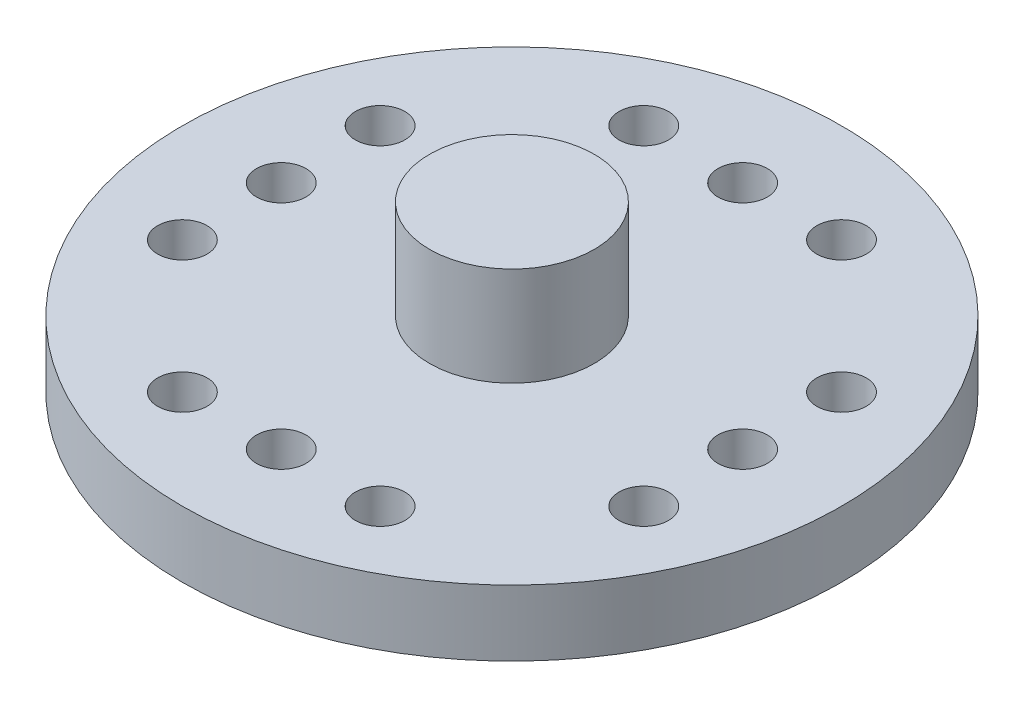
ISO-10303-21;
HEADER;
FILE_DESCRIPTION(('STEP AP214'),'2;1');
FILE_NAME('part.step','',(''),(''),'','','');
FILE_SCHEMA(('AUTOMOTIVE_DESIGN { 1 0 10303 214 1 1 1 1 }'));
ENDSEC;
DATA;
#1=APPLICATION_CONTEXT('core data for automotive mechanical design processes');
#2=APPLICATION_PROTOCOL_DEFINITION('international standard','automotive_design',2000,#1);
#3=PRODUCT_CONTEXT('',#1,'mechanical');
#4=PRODUCT('Part','Part','',(#3));
#5=PRODUCT_RELATED_PRODUCT_CATEGORY('part','',(#4));
#6=PRODUCT_DEFINITION_FORMATION('','',#4);
#7=PRODUCT_DEFINITION_CONTEXT('part definition',#1,'design');
#8=PRODUCT_DEFINITION('design','',#6,#7);
#9=PRODUCT_DEFINITION_SHAPE('','',#8);
#10=(LENGTH_UNIT() NAMED_UNIT(*) SI_UNIT(.MILLI.,.METRE.));
#11=(NAMED_UNIT(*) PLANE_ANGLE_UNIT() SI_UNIT($,.RADIAN.));
#12=(NAMED_UNIT(*) SI_UNIT($,.STERADIAN.) SOLID_ANGLE_UNIT());
#13=UNCERTAINTY_MEASURE_WITH_UNIT(LENGTH_MEASURE(1.E-05),#10,'distance_accuracy_value','');
#14=(GEOMETRIC_REPRESENTATION_CONTEXT(3) GLOBAL_UNCERTAINTY_ASSIGNED_CONTEXT((#13)) GLOBAL_UNIT_ASSIGNED_CONTEXT((#10,
#11,#12)) REPRESENTATION_CONTEXT('',''));
#15=CARTESIAN_POINT('',(0.,0.,0.));
#16=DIRECTION('',(0.,0.,1.));
#17=DIRECTION('',(1.,0.,0.));
#18=AXIS2_PLACEMENT_3D('',#15,#16,#17);
#19=CARTESIAN_POINT('',(0.,2.,0.));
#20=DIRECTION('',(0.,-1.,0.));
#21=DIRECTION('',(0.,0.,-1.));
#22=AXIS2_PLACEMENT_3D('',#19,#20,#21);
#23=CYLINDRICAL_SURFACE('',#22,10.);
#24=CARTESIAN_POINT('',(0.,2.,0.));
#25=DIRECTION('',(0.,1.,0.));
#26=DIRECTION('',(0.,0.,1.));
#27=AXIS2_PLACEMENT_3D('',#24,#25,#26);
#28=CIRCLE('',#27,10.);
#29=CARTESIAN_POINT('',(0.,2.,10.));
#30=VERTEX_POINT('',#29);
#31=EDGE_CURVE('E45',#30,#30,#28,.T.);
#32=ORIENTED_EDGE('',*,*,#31,.F.);
#33=EDGE_LOOP('',(#32));
#34=FACE_BOUND('',#33,.T.);
#35=CARTESIAN_POINT('',(0.,0.,0.));
#36=DIRECTION('',(0.,1.,0.));
#37=DIRECTION('',(0.,0.,1.));
#38=AXIS2_PLACEMENT_3D('',#35,#36,#37);
#39=CIRCLE('',#38,10.);
#40=CARTESIAN_POINT('',(0.,0.,10.));
#41=VERTEX_POINT('',#40);
#42=EDGE_CURVE('E40',#41,#41,#39,.T.);
#43=ORIENTED_EDGE('',*,*,#42,.T.);
#44=EDGE_LOOP('',(#43));
#45=FACE_BOUND('',#44,.T.);
#46=ADVANCED_FACE('F37',(#34,#45),#23,.T.);
#47=CARTESIAN_POINT('',(0.,2.,0.));
#48=DIRECTION('',(0.,1.,0.));
#49=DIRECTION('',(0.,0.,1.));
#50=AXIS2_PLACEMENT_3D('',#47,#48,#49);
#51=PLANE('',#50);
#52=CARTESIAN_POINT('',(-3.,2.,-7.));
#53=DIRECTION('',(0.,1.,0.));
#54=DIRECTION('',(0.,0.,1.));
#55=AXIS2_PLACEMENT_3D('',#52,#53,#54);
#56=CIRCLE('',#55,0.75);
#57=CARTESIAN_POINT('',(-3.,2.,-6.25));
#58=VERTEX_POINT('',#57);
#59=EDGE_CURVE('E61',#58,#58,#56,.T.);
#60=ORIENTED_EDGE('',*,*,#59,.F.);
#61=EDGE_LOOP('',(#60));
#62=FACE_BOUND('',#61,.T.);
#63=CARTESIAN_POINT('',(0.,2.,-7.));
#64=DIRECTION('',(0.,1.,0.));
#65=DIRECTION('',(0.,0.,1.));
#66=AXIS2_PLACEMENT_3D('',#63,#64,#65);
#67=CIRCLE('',#66,0.75);
#68=CARTESIAN_POINT('',(0.,2.,-6.25));
#69=VERTEX_POINT('',#68);
#70=EDGE_CURVE('E118',#69,#69,#67,.T.);
#71=ORIENTED_EDGE('',*,*,#70,.F.);
#72=EDGE_LOOP('',(#71));
#73=FACE_BOUND('',#72,.T.);
#74=CARTESIAN_POINT('',(3.,2.,-7.));
#75=DIRECTION('',(0.,1.,0.));
#76=DIRECTION('',(0.,0.,1.));
#77=AXIS2_PLACEMENT_3D('',#74,#75,#76);
#78=CIRCLE('',#77,0.75);
#79=CARTESIAN_POINT('',(3.,2.,-6.25));
#80=VERTEX_POINT('',#79);
#81=EDGE_CURVE('E110',#80,#80,#78,.T.);
#82=ORIENTED_EDGE('',*,*,#81,.F.);
#83=EDGE_LOOP('',(#82));
#84=FACE_BOUND('',#83,.T.);
#85=CARTESIAN_POINT('',(7.00000000000051,2.,-3.00000000000068));
#86=DIRECTION('',(0.,1.,0.));
#87=DIRECTION('',(0.,0.,1.));
#88=AXIS2_PLACEMENT_3D('',#85,#86,#87);
#89=CIRCLE('',#88,0.750000000000525);
#90=CARTESIAN_POINT('',(7.00000000000051,2.,-2.25000000000015));
#91=VERTEX_POINT('',#90);
#92=EDGE_CURVE('E102',#91,#91,#89,.T.);
#93=ORIENTED_EDGE('',*,*,#92,.F.);
#94=EDGE_LOOP('',(#93));
#95=FACE_BOUND('',#94,.T.);
#96=CARTESIAN_POINT('',(7.00000000000051,2.,-6.77969384008271E-13));
#97=DIRECTION('',(0.,1.,0.));
#98=DIRECTION('',(0.,0.,1.));
#99=AXIS2_PLACEMENT_3D('',#96,#97,#98);
#100=CIRCLE('',#99,0.750000000000522);
#101=CARTESIAN_POINT('',(7.00000000000051,2.,0.749999999999844));
#102=VERTEX_POINT('',#101);
#103=EDGE_CURVE('E94',#102,#102,#100,.T.);
#104=ORIENTED_EDGE('',*,*,#103,.F.);
#105=EDGE_LOOP('',(#104));
#106=FACE_BOUND('',#105,.T.);
#107=CARTESIAN_POINT('',(7.00000000000051,2.,2.99999999999932));
#108=DIRECTION('',(0.,1.,0.));
#109=DIRECTION('',(0.,0.,1.));
#110=AXIS2_PLACEMENT_3D('',#107,#108,#109);
#111=CIRCLE('',#110,0.750000000000518);
#112=CARTESIAN_POINT('',(7.00000000000051,2.,3.74999999999984));
#113=VERTEX_POINT('',#112);
#114=EDGE_CURVE('E86',#113,#113,#111,.T.);
#115=ORIENTED_EDGE('',*,*,#114,.F.);
#116=EDGE_LOOP('',(#115));
#117=FACE_BOUND('',#116,.T.);
#118=CARTESIAN_POINT('',(3.00000000000119,2.,6.99999999999984));
#119=DIRECTION('',(0.,1.,0.));
#120=DIRECTION('',(0.,0.,1.));
#121=AXIS2_PLACEMENT_3D('',#118,#119,#120);
#122=CIRCLE('',#121,0.75000000000124);
#123=CARTESIAN_POINT('',(3.00000000000119,2.,7.75000000000108));
#124=VERTEX_POINT('',#123);
#125=EDGE_CURVE('E78',#124,#124,#122,.T.);
#126=ORIENTED_EDGE('',*,*,#125,.F.);
#127=EDGE_LOOP('',(#126));
#128=FACE_BOUND('',#127,.T.);
#129=CARTESIAN_POINT('',(-2.99999999999881,2.,6.99999999999984));
#130=DIRECTION('',(0.,1.,0.));
#131=DIRECTION('',(0.,0.,1.));
#132=AXIS2_PLACEMENT_3D('',#129,#130,#131);
#133=CIRCLE('',#132,0.750000000001228);
#134=CARTESIAN_POINT('',(-2.99999999999881,2.,7.75000000000106));
#135=VERTEX_POINT('',#134);
#136=EDGE_CURVE('E69',#135,#135,#133,.T.);
#137=ORIENTED_EDGE('',*,*,#136,.F.);
#138=EDGE_LOOP('',(#137));
#139=FACE_BOUND('',#138,.T.);
#140=CARTESIAN_POINT('',(-6.99999999999932,2.,3.00000000000051));
#141=DIRECTION('',(0.,1.,0.));
#142=DIRECTION('',(0.,0.,1.));
#143=AXIS2_PLACEMENT_3D('',#140,#141,#142);
#144=CIRCLE('',#143,0.750000000000769);
#145=CARTESIAN_POINT('',(-6.99999999999932,2.,3.75000000000128));
#146=VERTEX_POINT('',#145);
#147=EDGE_CURVE('E70',#146,#146,#144,.T.);
#148=ORIENTED_EDGE('',*,*,#147,.F.);
#149=EDGE_LOOP('',(#148));
#150=FACE_BOUND('',#149,.T.);
#151=CARTESIAN_POINT('',(-6.99999999999932,2.,5.14027906549877E-13));
#152=DIRECTION('',(0.,1.,0.));
#153=DIRECTION('',(0.,0.,1.));
#154=AXIS2_PLACEMENT_3D('',#151,#152,#153);
#155=CIRCLE('',#154,0.75000000000076);
#156=CARTESIAN_POINT('',(-6.99999999999932,2.,0.750000000001274));
#157=VERTEX_POINT('',#156);
#158=EDGE_CURVE('E141',#157,#157,#155,.T.);
#159=ORIENTED_EDGE('',*,*,#158,.F.);
#160=EDGE_LOOP('',(#159));
#161=FACE_BOUND('',#160,.T.);
#162=CARTESIAN_POINT('',(1.19114003779875E-12,2.,6.99999999999984));
#163=DIRECTION('',(0.,1.,0.));
#164=DIRECTION('',(0.,0.,1.));
#165=AXIS2_PLACEMENT_3D('',#162,#163,#164);
#166=CIRCLE('',#165,0.750000000001234);
#167=CARTESIAN_POINT('',(1.19114003779875E-12,2.,7.75000000000107));
#168=VERTEX_POINT('',#167);
#169=EDGE_CURVE('E133',#168,#168,#166,.T.);
#170=ORIENTED_EDGE('',*,*,#169,.F.);
#171=EDGE_LOOP('',(#170));
#172=FACE_BOUND('',#171,.T.);
#173=CARTESIAN_POINT('',(-6.99999999999932,2.,-2.99999999999949));
#174=DIRECTION('',(0.,1.,0.));
#175=DIRECTION('',(0.,0.,1.));
#176=AXIS2_PLACEMENT_3D('',#173,#174,#175);
#177=CIRCLE('',#176,0.75000000000075);
#178=CARTESIAN_POINT('',(-6.99999999999932,2.,-2.24999999999874));
#179=VERTEX_POINT('',#178);
#180=EDGE_CURVE('E57',#179,#179,#177,.T.);
#181=ORIENTED_EDGE('',*,*,#180,.F.);
#182=EDGE_LOOP('',(#181));
#183=FACE_BOUND('',#182,.T.);
#184=CARTESIAN_POINT('',(0.,2.,0.));
#185=DIRECTION('',(0.,1.,0.));
#186=DIRECTION('',(0.,0.,1.));
#187=AXIS2_PLACEMENT_3D('',#184,#185,#186);
#188=CIRCLE('',#187,2.5);
#189=CARTESIAN_POINT('',(0.,2.,2.5));
#190=VERTEX_POINT('',#189);
#191=EDGE_CURVE('E10',#190,#190,#188,.T.);
#192=ORIENTED_EDGE('',*,*,#191,.F.);
#193=EDGE_LOOP('',(#192));
#194=FACE_BOUND('',#193,.T.);
#195=ORIENTED_EDGE('',*,*,#31,.T.);
#196=EDGE_LOOP('',(#195));
#197=FACE_BOUND('',#196,.T.);
#198=ADVANCED_FACE('F155',(#62,#73,#84,#95,#106,#117,#128,#139,#150,#161,#172,#183,#194,#197),
#51,.T.);
#199=CARTESIAN_POINT('',(0.,0.,0.));
#200=DIRECTION('',(0.,1.,0.));
#201=DIRECTION('',(0.,0.,1.));
#202=AXIS2_PLACEMENT_3D('',#199,#200,#201);
#203=PLANE('',#202);
#204=CARTESIAN_POINT('',(-3.,0.,-7.));
#205=DIRECTION('',(0.,1.,0.));
#206=DIRECTION('',(0.,0.,1.));
#207=AXIS2_PLACEMENT_3D('',#204,#205,#206);
#208=CIRCLE('',#207,0.75);
#209=CARTESIAN_POINT('',(-3.,0.,-6.25));
#210=VERTEX_POINT('',#209);
#211=EDGE_CURVE('E122',#210,#210,#208,.T.);
#212=ORIENTED_EDGE('',*,*,#211,.T.);
#213=EDGE_LOOP('',(#212));
#214=FACE_BOUND('',#213,.T.);
#215=CARTESIAN_POINT('',(0.,0.,-7.));
#216=DIRECTION('',(0.,1.,0.));
#217=DIRECTION('',(0.,0.,1.));
#218=AXIS2_PLACEMENT_3D('',#215,#216,#217);
#219=CIRCLE('',#218,0.75);
#220=CARTESIAN_POINT('',(0.,0.,-6.25));
#221=VERTEX_POINT('',#220);
#222=EDGE_CURVE('E114',#221,#221,#219,.T.);
#223=ORIENTED_EDGE('',*,*,#222,.T.);
#224=EDGE_LOOP('',(#223));
#225=FACE_BOUND('',#224,.T.);
#226=CARTESIAN_POINT('',(3.,0.,-7.));
#227=DIRECTION('',(0.,1.,0.));
#228=DIRECTION('',(0.,0.,1.));
#229=AXIS2_PLACEMENT_3D('',#226,#227,#228);
#230=CIRCLE('',#229,0.75);
#231=CARTESIAN_POINT('',(3.,0.,-6.25));
#232=VERTEX_POINT('',#231);
#233=EDGE_CURVE('E106',#232,#232,#230,.T.);
#234=ORIENTED_EDGE('',*,*,#233,.T.);
#235=EDGE_LOOP('',(#234));
#236=FACE_BOUND('',#235,.T.);
#237=CARTESIAN_POINT('',(7.00000000000051,0.,-3.00000000000068));
#238=DIRECTION('',(0.,1.,0.));
#239=DIRECTION('',(0.,0.,1.));
#240=AXIS2_PLACEMENT_3D('',#237,#238,#239);
#241=CIRCLE('',#240,0.750000000000525);
#242=CARTESIAN_POINT('',(7.00000000000051,0.,-2.25000000000015));
#243=VERTEX_POINT('',#242);
#244=EDGE_CURVE('E98',#243,#243,#241,.T.);
#245=ORIENTED_EDGE('',*,*,#244,.T.);
#246=EDGE_LOOP('',(#245));
#247=FACE_BOUND('',#246,.T.);
#248=CARTESIAN_POINT('',(7.00000000000051,0.,-6.77969384008271E-13));
#249=DIRECTION('',(0.,1.,0.));
#250=DIRECTION('',(0.,0.,1.));
#251=AXIS2_PLACEMENT_3D('',#248,#249,#250);
#252=CIRCLE('',#251,0.750000000000522);
#253=CARTESIAN_POINT('',(7.00000000000051,0.,0.749999999999844));
#254=VERTEX_POINT('',#253);
#255=EDGE_CURVE('E90',#254,#254,#252,.T.);
#256=ORIENTED_EDGE('',*,*,#255,.T.);
#257=EDGE_LOOP('',(#256));
#258=FACE_BOUND('',#257,.T.);
#259=CARTESIAN_POINT('',(7.00000000000051,0.,2.99999999999932));
#260=DIRECTION('',(0.,1.,0.));
#261=DIRECTION('',(0.,0.,1.));
#262=AXIS2_PLACEMENT_3D('',#259,#260,#261);
#263=CIRCLE('',#262,0.750000000000518);
#264=CARTESIAN_POINT('',(7.00000000000051,0.,3.74999999999984));
#265=VERTEX_POINT('',#264);
#266=EDGE_CURVE('E82',#265,#265,#263,.T.);
#267=ORIENTED_EDGE('',*,*,#266,.T.);
#268=EDGE_LOOP('',(#267));
#269=FACE_BOUND('',#268,.T.);
#270=CARTESIAN_POINT('',(3.00000000000119,0.,6.99999999999984));
#271=DIRECTION('',(0.,1.,0.));
#272=DIRECTION('',(0.,0.,1.));
#273=AXIS2_PLACEMENT_3D('',#270,#271,#272);
#274=CIRCLE('',#273,0.75000000000124);
#275=CARTESIAN_POINT('',(3.00000000000119,0.,7.75000000000108));
#276=VERTEX_POINT('',#275);
#277=EDGE_CURVE('E74',#276,#276,#274,.T.);
#278=ORIENTED_EDGE('',*,*,#277,.T.);
#279=EDGE_LOOP('',(#278));
#280=FACE_BOUND('',#279,.T.);
#281=CARTESIAN_POINT('',(-2.99999999999881,0.,6.99999999999984));
#282=DIRECTION('',(0.,1.,0.));
#283=DIRECTION('',(0.,0.,1.));
#284=AXIS2_PLACEMENT_3D('',#281,#282,#283);
#285=CIRCLE('',#284,0.750000000001228);
#286=CARTESIAN_POINT('',(-2.99999999999881,0.,7.75000000000106));
#287=VERTEX_POINT('',#286);
#288=EDGE_CURVE('E65',#287,#287,#285,.T.);
#289=ORIENTED_EDGE('',*,*,#288,.T.);
#290=EDGE_LOOP('',(#289));
#291=FACE_BOUND('',#290,.T.);
#292=CARTESIAN_POINT('',(-6.99999999999932,0.,3.00000000000051));
#293=DIRECTION('',(0.,1.,0.));
#294=DIRECTION('',(0.,0.,1.));
#295=AXIS2_PLACEMENT_3D('',#292,#293,#294);
#296=CIRCLE('',#295,0.750000000000769);
#297=CARTESIAN_POINT('',(-6.99999999999932,0.,3.75000000000128));
#298=VERTEX_POINT('',#297);
#299=EDGE_CURVE('E145',#298,#298,#296,.T.);
#300=ORIENTED_EDGE('',*,*,#299,.T.);
#301=EDGE_LOOP('',(#300));
#302=FACE_BOUND('',#301,.T.);
#303=CARTESIAN_POINT('',(-6.99999999999932,0.,5.14027906549877E-13));
#304=DIRECTION('',(0.,1.,0.));
#305=DIRECTION('',(0.,0.,1.));
#306=AXIS2_PLACEMENT_3D('',#303,#304,#305);
#307=CIRCLE('',#306,0.75000000000076);
#308=CARTESIAN_POINT('',(-6.99999999999932,0.,0.750000000001274));
#309=VERTEX_POINT('',#308);
#310=EDGE_CURVE('E137',#309,#309,#307,.T.);
#311=ORIENTED_EDGE('',*,*,#310,.T.);
#312=EDGE_LOOP('',(#311));
#313=FACE_BOUND('',#312,.T.);
#314=CARTESIAN_POINT('',(1.19114003779875E-12,0.,6.99999999999984));
#315=DIRECTION('',(0.,1.,0.));
#316=DIRECTION('',(0.,0.,1.));
#317=AXIS2_PLACEMENT_3D('',#314,#315,#316);
#318=CIRCLE('',#317,0.750000000001234);
#319=CARTESIAN_POINT('',(1.19114003779875E-12,0.,7.75000000000107));
#320=VERTEX_POINT('',#319);
#321=EDGE_CURVE('E129',#320,#320,#318,.T.);
#322=ORIENTED_EDGE('',*,*,#321,.T.);
#323=EDGE_LOOP('',(#322));
#324=FACE_BOUND('',#323,.T.);
#325=CARTESIAN_POINT('',(-6.99999999999932,0.,-2.99999999999949));
#326=DIRECTION('',(0.,1.,0.));
#327=DIRECTION('',(0.,0.,1.));
#328=AXIS2_PLACEMENT_3D('',#325,#326,#327);
#329=CIRCLE('',#328,0.75000000000075);
#330=CARTESIAN_POINT('',(-6.99999999999932,0.,-2.24999999999874));
#331=VERTEX_POINT('',#330);
#332=EDGE_CURVE('E56',#331,#331,#329,.T.);
#333=ORIENTED_EDGE('',*,*,#332,.T.);
#334=EDGE_LOOP('',(#333));
#335=FACE_BOUND('',#334,.T.);
#336=ORIENTED_EDGE('',*,*,#42,.F.);
#337=EDGE_LOOP('',(#336));
#338=FACE_BOUND('',#337,.T.);
#339=ADVANCED_FACE('F158',(#214,#225,#236,#247,#258,#269,#280,#291,#302,#313,#324,#335,#338),
#203,.F.);
#340=CARTESIAN_POINT('',(0.,5.,0.));
#341=DIRECTION('',(0.,-1.,0.));
#342=DIRECTION('',(0.,0.,-1.));
#343=AXIS2_PLACEMENT_3D('',#340,#341,#342);
#344=CYLINDRICAL_SURFACE('',#343,2.5);
#345=CARTESIAN_POINT('',(0.,5.,0.));
#346=DIRECTION('',(0.,1.,0.));
#347=DIRECTION('',(0.,0.,1.));
#348=AXIS2_PLACEMENT_3D('',#345,#346,#347);
#349=CIRCLE('',#348,2.5);
#350=CARTESIAN_POINT('',(0.,5.,2.5));
#351=VERTEX_POINT('',#350);
#352=EDGE_CURVE('E52',#351,#351,#349,.T.);
#353=ORIENTED_EDGE('',*,*,#352,.F.);
#354=EDGE_LOOP('',(#353));
#355=FACE_BOUND('',#354,.T.);
#356=ORIENTED_EDGE('',*,*,#191,.T.);
#357=EDGE_LOOP('',(#356));
#358=FACE_BOUND('',#357,.T.);
#359=ADVANCED_FACE('F177',(#355,#358),#344,.T.);
#360=CARTESIAN_POINT('',(0.,5.,0.));
#361=DIRECTION('',(0.,1.,0.));
#362=DIRECTION('',(0.,0.,1.));
#363=AXIS2_PLACEMENT_3D('',#360,#361,#362);
#364=PLANE('',#363);
#365=ORIENTED_EDGE('',*,*,#352,.T.);
#366=EDGE_LOOP('',(#365));
#367=FACE_BOUND('',#366,.T.);
#368=ADVANCED_FACE('F182',(#367),#364,.T.);
#369=CARTESIAN_POINT('',(-6.99999999999932,0.,-2.99999999999949));
#370=DIRECTION('',(0.,1.,0.));
#371=DIRECTION('',(0.,0.,1.));
#372=AXIS2_PLACEMENT_3D('',#369,#370,#371);
#373=CYLINDRICAL_SURFACE('',#372,0.75000000000075);
#374=ORIENTED_EDGE('',*,*,#332,.F.);
#375=EDGE_LOOP('',(#374));
#376=FACE_BOUND('',#375,.T.);
#377=ORIENTED_EDGE('',*,*,#180,.T.);
#378=EDGE_LOOP('',(#377));
#379=FACE_BOUND('',#378,.T.);
#380=ADVANCED_FACE('F189',(#376,#379),#373,.F.);
#381=CARTESIAN_POINT('',(1.19114003779875E-12,0.,6.99999999999984));
#382=DIRECTION('',(0.,1.,0.));
#383=DIRECTION('',(0.,0.,1.));
#384=AXIS2_PLACEMENT_3D('',#381,#382,#383);
#385=CYLINDRICAL_SURFACE('',#384,0.750000000001234);
#386=ORIENTED_EDGE('',*,*,#321,.F.);
#387=EDGE_LOOP('',(#386));
#388=FACE_BOUND('',#387,.T.);
#389=ORIENTED_EDGE('',*,*,#169,.T.);
#390=EDGE_LOOP('',(#389));
#391=FACE_BOUND('',#390,.T.);
#392=ADVANCED_FACE('F193',(#388,#391),#385,.F.);
#393=CARTESIAN_POINT('',(-6.99999999999932,0.,5.14027906549877E-13));
#394=DIRECTION('',(0.,1.,0.));
#395=DIRECTION('',(0.,0.,1.));
#396=AXIS2_PLACEMENT_3D('',#393,#394,#395);
#397=CYLINDRICAL_SURFACE('',#396,0.75000000000076);
#398=ORIENTED_EDGE('',*,*,#310,.F.);
#399=EDGE_LOOP('',(#398));
#400=FACE_BOUND('',#399,.T.);
#401=ORIENTED_EDGE('',*,*,#158,.T.);
#402=EDGE_LOOP('',(#401));
#403=FACE_BOUND('',#402,.T.);
#404=ADVANCED_FACE('F229',(#400,#403),#397,.F.);
#405=CARTESIAN_POINT('',(-6.99999999999932,0.,3.00000000000051));
#406=DIRECTION('',(0.,1.,0.));
#407=DIRECTION('',(0.,0.,1.));
#408=AXIS2_PLACEMENT_3D('',#405,#406,#407);
#409=CYLINDRICAL_SURFACE('',#408,0.750000000000769);
#410=ORIENTED_EDGE('',*,*,#299,.F.);
#411=EDGE_LOOP('',(#410));
#412=FACE_BOUND('',#411,.T.);
#413=ORIENTED_EDGE('',*,*,#147,.T.);
#414=EDGE_LOOP('',(#413));
#415=FACE_BOUND('',#414,.T.);
#416=ADVANCED_FACE('F153',(#412,#415),#409,.F.);
#417=CARTESIAN_POINT('',(-2.99999999999881,0.,6.99999999999984));
#418=DIRECTION('',(0.,1.,0.));
#419=DIRECTION('',(0.,0.,1.));
#420=AXIS2_PLACEMENT_3D('',#417,#418,#419);
#421=CYLINDRICAL_SURFACE('',#420,0.750000000001228);
#422=ORIENTED_EDGE('',*,*,#288,.F.);
#423=EDGE_LOOP('',(#422));
#424=FACE_BOUND('',#423,.T.);
#425=ORIENTED_EDGE('',*,*,#136,.T.);
#426=EDGE_LOOP('',(#425));
#427=FACE_BOUND('',#426,.T.);
#428=ADVANCED_FACE('F195',(#424,#427),#421,.F.);
#429=CARTESIAN_POINT('',(3.00000000000119,0.,6.99999999999984));
#430=DIRECTION('',(0.,1.,0.));
#431=DIRECTION('',(0.,0.,1.));
#432=AXIS2_PLACEMENT_3D('',#429,#430,#431);
#433=CYLINDRICAL_SURFACE('',#432,0.75000000000124);
#434=ORIENTED_EDGE('',*,*,#277,.F.);
#435=EDGE_LOOP('',(#434));
#436=FACE_BOUND('',#435,.T.);
#437=ORIENTED_EDGE('',*,*,#125,.T.);
#438=EDGE_LOOP('',(#437));
#439=FACE_BOUND('',#438,.T.);
#440=ADVANCED_FACE('F198',(#436,#439),#433,.F.);
#441=CARTESIAN_POINT('',(7.00000000000051,0.,2.99999999999932));
#442=DIRECTION('',(0.,1.,0.));
#443=DIRECTION('',(0.,0.,1.));
#444=AXIS2_PLACEMENT_3D('',#441,#442,#443);
#445=CYLINDRICAL_SURFACE('',#444,0.750000000000518);
#446=ORIENTED_EDGE('',*,*,#266,.F.);
#447=EDGE_LOOP('',(#446));
#448=FACE_BOUND('',#447,.T.);
#449=ORIENTED_EDGE('',*,*,#114,.T.);
#450=EDGE_LOOP('',(#449));
#451=FACE_BOUND('',#450,.T.);
#452=ADVANCED_FACE('F202',(#448,#451),#445,.F.);
#453=CARTESIAN_POINT('',(7.00000000000051,0.,-6.77969384008271E-13));
#454=DIRECTION('',(0.,1.,0.));
#455=DIRECTION('',(0.,0.,1.));
#456=AXIS2_PLACEMENT_3D('',#453,#454,#455);
#457=CYLINDRICAL_SURFACE('',#456,0.750000000000522);
#458=ORIENTED_EDGE('',*,*,#255,.F.);
#459=EDGE_LOOP('',(#458));
#460=FACE_BOUND('',#459,.T.);
#461=ORIENTED_EDGE('',*,*,#103,.T.);
#462=EDGE_LOOP('',(#461));
#463=FACE_BOUND('',#462,.T.);
#464=ADVANCED_FACE('F206',(#460,#463),#457,.F.);
#465=CARTESIAN_POINT('',(7.00000000000051,0.,-3.00000000000068));
#466=DIRECTION('',(0.,1.,0.));
#467=DIRECTION('',(0.,0.,1.));
#468=AXIS2_PLACEMENT_3D('',#465,#466,#467);
#469=CYLINDRICAL_SURFACE('',#468,0.750000000000525);
#470=ORIENTED_EDGE('',*,*,#244,.F.);
#471=EDGE_LOOP('',(#470));
#472=FACE_BOUND('',#471,.T.);
#473=ORIENTED_EDGE('',*,*,#92,.T.);
#474=EDGE_LOOP('',(#473));
#475=FACE_BOUND('',#474,.T.);
#476=ADVANCED_FACE('F210',(#472,#475),#469,.F.);
#477=CARTESIAN_POINT('',(3.,0.,-7.));
#478=DIRECTION('',(0.,1.,0.));
#479=DIRECTION('',(0.,0.,1.));
#480=AXIS2_PLACEMENT_3D('',#477,#478,#479);
#481=CYLINDRICAL_SURFACE('',#480,0.75);
#482=ORIENTED_EDGE('',*,*,#233,.F.);
#483=EDGE_LOOP('',(#482));
#484=FACE_BOUND('',#483,.T.);
#485=ORIENTED_EDGE('',*,*,#81,.T.);
#486=EDGE_LOOP('',(#485));
#487=FACE_BOUND('',#486,.T.);
#488=ADVANCED_FACE('F214',(#484,#487),#481,.F.);
#489=CARTESIAN_POINT('',(0.,0.,-7.));
#490=DIRECTION('',(0.,1.,0.));
#491=DIRECTION('',(0.,0.,1.));
#492=AXIS2_PLACEMENT_3D('',#489,#490,#491);
#493=CYLINDRICAL_SURFACE('',#492,0.75);
#494=ORIENTED_EDGE('',*,*,#222,.F.);
#495=EDGE_LOOP('',(#494));
#496=FACE_BOUND('',#495,.T.);
#497=ORIENTED_EDGE('',*,*,#70,.T.);
#498=EDGE_LOOP('',(#497));
#499=FACE_BOUND('',#498,.T.);
#500=ADVANCED_FACE('F218',(#496,#499),#493,.F.);
#501=CARTESIAN_POINT('',(-3.,0.,-7.));
#502=DIRECTION('',(0.,1.,0.));
#503=DIRECTION('',(0.,0.,1.));
#504=AXIS2_PLACEMENT_3D('',#501,#502,#503);
#505=CYLINDRICAL_SURFACE('',#504,0.75);
#506=ORIENTED_EDGE('',*,*,#211,.F.);
#507=EDGE_LOOP('',(#506));
#508=FACE_BOUND('',#507,.T.);
#509=ORIENTED_EDGE('',*,*,#59,.T.);
#510=EDGE_LOOP('',(#509));
#511=FACE_BOUND('',#510,.T.);
#512=ADVANCED_FACE('F222',(#508,#511),#505,.F.);
#513=CLOSED_SHELL('',(#46,#198,#339,#359,#368,#380,#392,#404,#416,#428,#440,#452,#464,#476,#488,
#500,#512));
#514=MANIFOLD_SOLID_BREP('B2',#513);
#515=ADVANCED_BREP_SHAPE_REPRESENTATION('',(#18,#514),#14);
#516=SHAPE_DEFINITION_REPRESENTATION(#9,#515);
ENDSEC;
END-ISO-10303-21;
